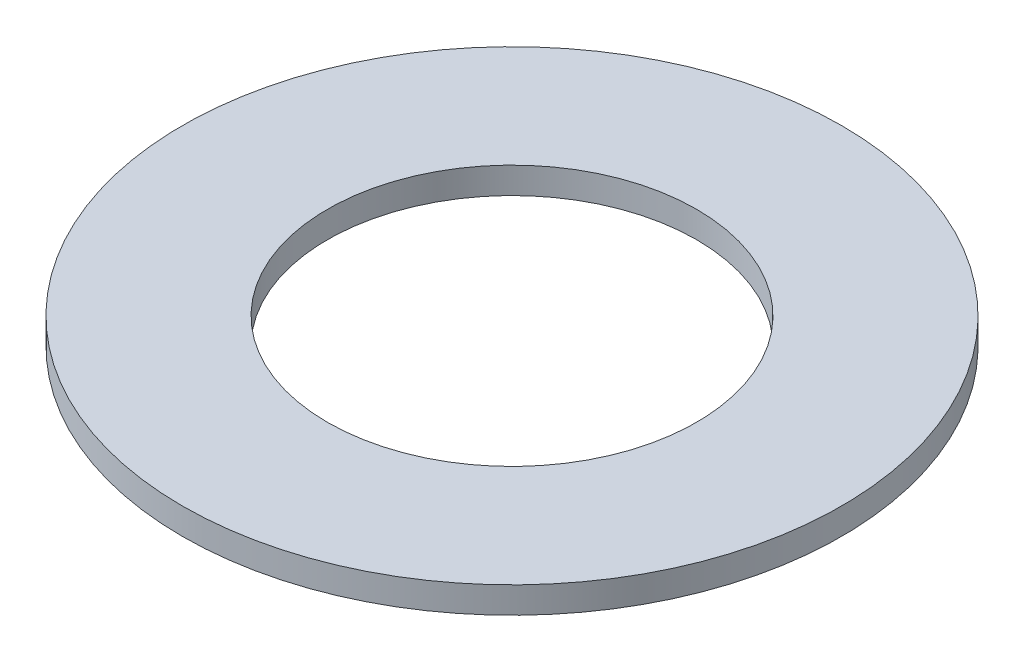
ISO-10303-21;
HEADER;
FILE_DESCRIPTION(('STEP AP214'),'2;1');
FILE_NAME('part.step','',(''),(''),'','','');
FILE_SCHEMA(('AUTOMOTIVE_DESIGN { 1 0 10303 214 1 1 1 1 }'));
ENDSEC;
DATA;
#1=APPLICATION_CONTEXT('core data for automotive mechanical design processes');
#2=APPLICATION_PROTOCOL_DEFINITION('international standard','automotive_design',2000,#1);
#3=PRODUCT_CONTEXT('',#1,'mechanical');
#4=PRODUCT('Part','Part','',(#3));
#5=PRODUCT_RELATED_PRODUCT_CATEGORY('part','',(#4));
#6=PRODUCT_DEFINITION_FORMATION('','',#4);
#7=PRODUCT_DEFINITION_CONTEXT('part definition',#1,'design');
#8=PRODUCT_DEFINITION('design','',#6,#7);
#9=PRODUCT_DEFINITION_SHAPE('','',#8);
#10=(LENGTH_UNIT() NAMED_UNIT(*) SI_UNIT(.MILLI.,.METRE.));
#11=(NAMED_UNIT(*) PLANE_ANGLE_UNIT() SI_UNIT($,.RADIAN.));
#12=(NAMED_UNIT(*) SI_UNIT($,.STERADIAN.) SOLID_ANGLE_UNIT());
#13=UNCERTAINTY_MEASURE_WITH_UNIT(LENGTH_MEASURE(1.E-05),#10,'distance_accuracy_value','');
#14=(GEOMETRIC_REPRESENTATION_CONTEXT(3) GLOBAL_UNCERTAINTY_ASSIGNED_CONTEXT((#13)) GLOBAL_UNIT_ASSIGNED_CONTEXT((#10,
#11,#12)) REPRESENTATION_CONTEXT('',''));
#15=CARTESIAN_POINT('',(0.,0.,0.));
#16=DIRECTION('',(0.,0.,1.));
#17=DIRECTION('',(1.,0.,0.));
#18=AXIS2_PLACEMENT_3D('',#15,#16,#17);
#19=CARTESIAN_POINT('',(0.,0.5,0.));
#20=DIRECTION('',(0.,1.,0.));
#21=DIRECTION('',(0.,0.,1.));
#22=AXIS2_PLACEMENT_3D('',#19,#20,#21);
#23=PLANE('',#22);
#24=CARTESIAN_POINT('',(0.,0.5,0.));
#25=DIRECTION('',(0.,1.,0.));
#26=DIRECTION('',(0.,0.,1.));
#27=AXIS2_PLACEMENT_3D('',#24,#25,#26);
#28=CIRCLE('',#27,12.5);
#29=CARTESIAN_POINT('',(0.,0.5,12.5));
#30=VERTEX_POINT('',#29);
#31=EDGE_CURVE('E10',#30,#30,#28,.T.);
#32=ORIENTED_EDGE('',*,*,#31,.T.);
#33=EDGE_LOOP('',(#32));
#34=FACE_BOUND('',#33,.T.);
#35=CARTESIAN_POINT('',(0.,0.5,0.));
#36=DIRECTION('',(0.,1.,0.));
#37=DIRECTION('',(0.,0.,1.));
#38=AXIS2_PLACEMENT_3D('',#35,#36,#37);
#39=CIRCLE('',#38,7.);
#40=CARTESIAN_POINT('',(0.,0.5,7.));
#41=VERTEX_POINT('',#40);
#42=EDGE_CURVE('E42',#41,#41,#39,.T.);
#43=ORIENTED_EDGE('',*,*,#42,.F.);
#44=EDGE_LOOP('',(#43));
#45=FACE_BOUND('',#44,.T.);
#46=ADVANCED_FACE('F31',(#34,#45),#23,.T.);
#47=CARTESIAN_POINT('',(0.,-0.5,0.));
#48=DIRECTION('',(0.,1.,0.));
#49=DIRECTION('',(0.,0.,1.));
#50=AXIS2_PLACEMENT_3D('',#47,#48,#49);
#51=PLANE('',#50);
#52=CARTESIAN_POINT('',(0.,-0.5,0.));
#53=DIRECTION('',(0.,1.,0.));
#54=DIRECTION('',(0.,0.,1.));
#55=AXIS2_PLACEMENT_3D('',#52,#53,#54);
#56=CIRCLE('',#55,12.5);
#57=CARTESIAN_POINT('',(0.,-0.5,12.5));
#58=VERTEX_POINT('',#57);
#59=EDGE_CURVE('E35',#58,#58,#56,.T.);
#60=ORIENTED_EDGE('',*,*,#59,.F.);
#61=EDGE_LOOP('',(#60));
#62=FACE_BOUND('',#61,.T.);
#63=CARTESIAN_POINT('',(0.,-0.5,0.));
#64=DIRECTION('',(0.,1.,0.));
#65=DIRECTION('',(0.,0.,1.));
#66=AXIS2_PLACEMENT_3D('',#63,#64,#65);
#67=CIRCLE('',#66,7.);
#68=CARTESIAN_POINT('',(0.,-0.5,7.));
#69=VERTEX_POINT('',#68);
#70=EDGE_CURVE('E44',#69,#69,#67,.T.);
#71=ORIENTED_EDGE('',*,*,#70,.T.);
#72=EDGE_LOOP('',(#71));
#73=FACE_BOUND('',#72,.T.);
#74=ADVANCED_FACE('F54',(#62,#73),#51,.F.);
#75=CARTESIAN_POINT('',(0.,0.5,0.));
#76=DIRECTION('',(0.,-1.,0.));
#77=DIRECTION('',(0.,0.,-1.));
#78=AXIS2_PLACEMENT_3D('',#75,#76,#77);
#79=CYLINDRICAL_SURFACE('',#78,12.5);
#80=ORIENTED_EDGE('',*,*,#31,.F.);
#81=EDGE_LOOP('',(#80));
#82=FACE_BOUND('',#81,.T.);
#83=ORIENTED_EDGE('',*,*,#59,.T.);
#84=EDGE_LOOP('',(#83));
#85=FACE_BOUND('',#84,.T.);
#86=ADVANCED_FACE('F33',(#82,#85),#79,.T.);
#87=CARTESIAN_POINT('',(0.,0.5,0.));
#88=DIRECTION('',(0.,-1.,0.));
#89=DIRECTION('',(0.,0.,-1.));
#90=AXIS2_PLACEMENT_3D('',#87,#88,#89);
#91=CYLINDRICAL_SURFACE('',#90,7.);
#92=ORIENTED_EDGE('',*,*,#42,.T.);
#93=EDGE_LOOP('',(#92));
#94=FACE_BOUND('',#93,.T.);
#95=ORIENTED_EDGE('',*,*,#70,.F.);
#96=EDGE_LOOP('',(#95));
#97=FACE_BOUND('',#96,.T.);
#98=ADVANCED_FACE('F50',(#94,#97),#91,.F.);
#99=CLOSED_SHELL('',(#46,#74,#86,#98));
#100=MANIFOLD_SOLID_BREP('B2',#99);
#101=ADVANCED_BREP_SHAPE_REPRESENTATION('',(#18,#100),#14);
#102=SHAPE_DEFINITION_REPRESENTATION(#9,#101);
ENDSEC;
END-ISO-10303-21;
